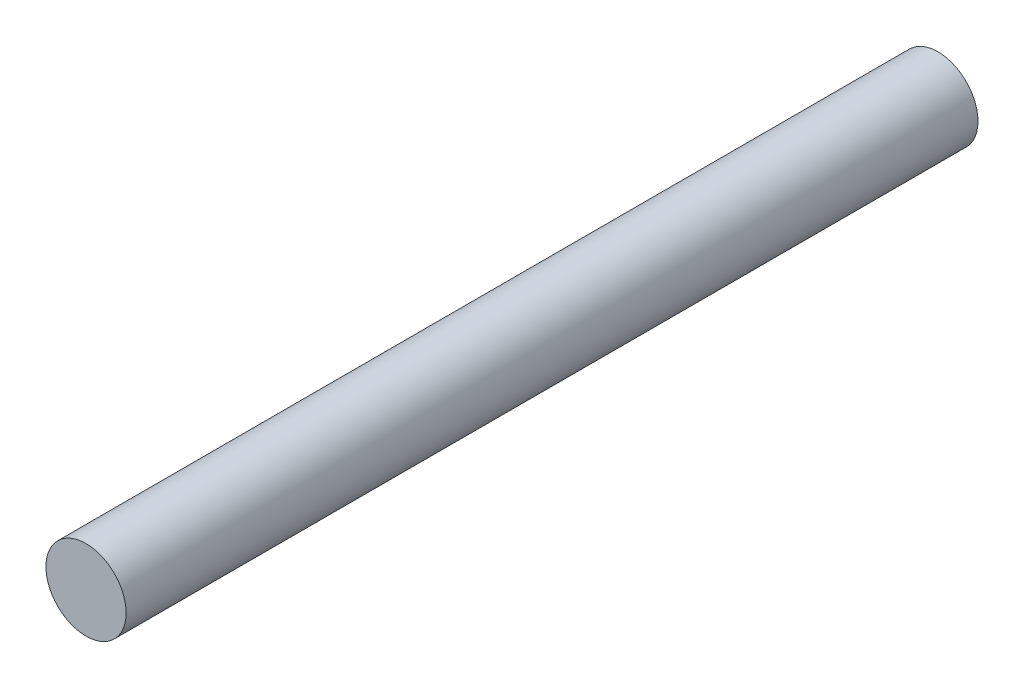
ISO-10303-21;
HEADER;
FILE_DESCRIPTION(('STEP AP214'),'2;1');
FILE_NAME('part.step','',(''),(''),'','','');
FILE_SCHEMA(('AUTOMOTIVE_DESIGN { 1 0 10303 214 1 1 1 1 }'));
ENDSEC;
DATA;
#1=APPLICATION_CONTEXT('core data for automotive mechanical design processes');
#2=APPLICATION_PROTOCOL_DEFINITION('international standard','automotive_design',2000,#1);
#3=PRODUCT_CONTEXT('',#1,'mechanical');
#4=PRODUCT('Part','Part','',(#3));
#5=PRODUCT_RELATED_PRODUCT_CATEGORY('part','',(#4));
#6=PRODUCT_DEFINITION_FORMATION('','',#4);
#7=PRODUCT_DEFINITION_CONTEXT('part definition',#1,'design');
#8=PRODUCT_DEFINITION('design','',#6,#7);
#9=PRODUCT_DEFINITION_SHAPE('','',#8);
#10=(LENGTH_UNIT() NAMED_UNIT(*) SI_UNIT(.MILLI.,.METRE.));
#11=(NAMED_UNIT(*) PLANE_ANGLE_UNIT() SI_UNIT($,.RADIAN.));
#12=(NAMED_UNIT(*) SI_UNIT($,.STERADIAN.) SOLID_ANGLE_UNIT());
#13=UNCERTAINTY_MEASURE_WITH_UNIT(LENGTH_MEASURE(1.E-05),#10,'distance_accuracy_value','');
#14=(GEOMETRIC_REPRESENTATION_CONTEXT(3) GLOBAL_UNCERTAINTY_ASSIGNED_CONTEXT((#13)) GLOBAL_UNIT_ASSIGNED_CONTEXT((#10,
#11,#12)) REPRESENTATION_CONTEXT('',''));
#15=CARTESIAN_POINT('',(0.,0.,0.));
#16=DIRECTION('',(0.,0.,1.));
#17=DIRECTION('',(1.,0.,0.));
#18=AXIS2_PLACEMENT_3D('',#15,#16,#17);
#19=CARTESIAN_POINT('',(0.,0.,42.5));
#20=DIRECTION('',(0.,0.,-1.));
#21=DIRECTION('',(-1.,0.,0.));
#22=AXIS2_PLACEMENT_3D('',#19,#20,#21);
#23=CYLINDRICAL_SURFACE('',#22,2.);
#24=CARTESIAN_POINT('',(0.,0.,42.5));
#25=DIRECTION('',(0.,0.,1.));
#26=DIRECTION('',(1.,0.,0.));
#27=AXIS2_PLACEMENT_3D('',#24,#25,#26);
#28=CIRCLE('',#27,2.);
#29=CARTESIAN_POINT('',(2.,0.,42.5));
#30=VERTEX_POINT('',#29);
#31=EDGE_CURVE('E10',#30,#30,#28,.T.);
#32=ORIENTED_EDGE('',*,*,#31,.F.);
#33=EDGE_LOOP('',(#32));
#34=FACE_BOUND('',#33,.T.);
#35=CARTESIAN_POINT('',(0.,0.,0.));
#36=DIRECTION('',(0.,0.,1.));
#37=DIRECTION('',(1.,0.,0.));
#38=AXIS2_PLACEMENT_3D('',#35,#36,#37);
#39=CIRCLE('',#38,2.);
#40=CARTESIAN_POINT('',(2.,0.,0.));
#41=VERTEX_POINT('',#40);
#42=EDGE_CURVE('E36',#41,#41,#39,.T.);
#43=ORIENTED_EDGE('',*,*,#42,.T.);
#44=EDGE_LOOP('',(#43));
#45=FACE_BOUND('',#44,.T.);
#46=ADVANCED_FACE('F33',(#34,#45),#23,.T.);
#47=CARTESIAN_POINT('',(0.,0.,42.5));
#48=DIRECTION('',(0.,0.,1.));
#49=DIRECTION('',(1.,0.,0.));
#50=AXIS2_PLACEMENT_3D('',#47,#48,#49);
#51=PLANE('',#50);
#52=ORIENTED_EDGE('',*,*,#31,.T.);
#53=EDGE_LOOP('',(#52));
#54=FACE_BOUND('',#53,.T.);
#55=ADVANCED_FACE('F48',(#54),#51,.T.);
#56=CARTESIAN_POINT('',(0.,0.,0.));
#57=DIRECTION('',(0.,0.,1.));
#58=DIRECTION('',(1.,0.,0.));
#59=AXIS2_PLACEMENT_3D('',#56,#57,#58);
#60=PLANE('',#59);
#61=ORIENTED_EDGE('',*,*,#42,.F.);
#62=EDGE_LOOP('',(#61));
#63=FACE_BOUND('',#62,.T.);
#64=ADVANCED_FACE('F46',(#63),#60,.F.);
#65=CLOSED_SHELL('',(#46,#55,#64));
#66=MANIFOLD_SOLID_BREP('B2',#65);
#67=ADVANCED_BREP_SHAPE_REPRESENTATION('',(#18,#66),#14);
#68=SHAPE_DEFINITION_REPRESENTATION(#9,#67);
ENDSEC;
END-ISO-10303-21;
